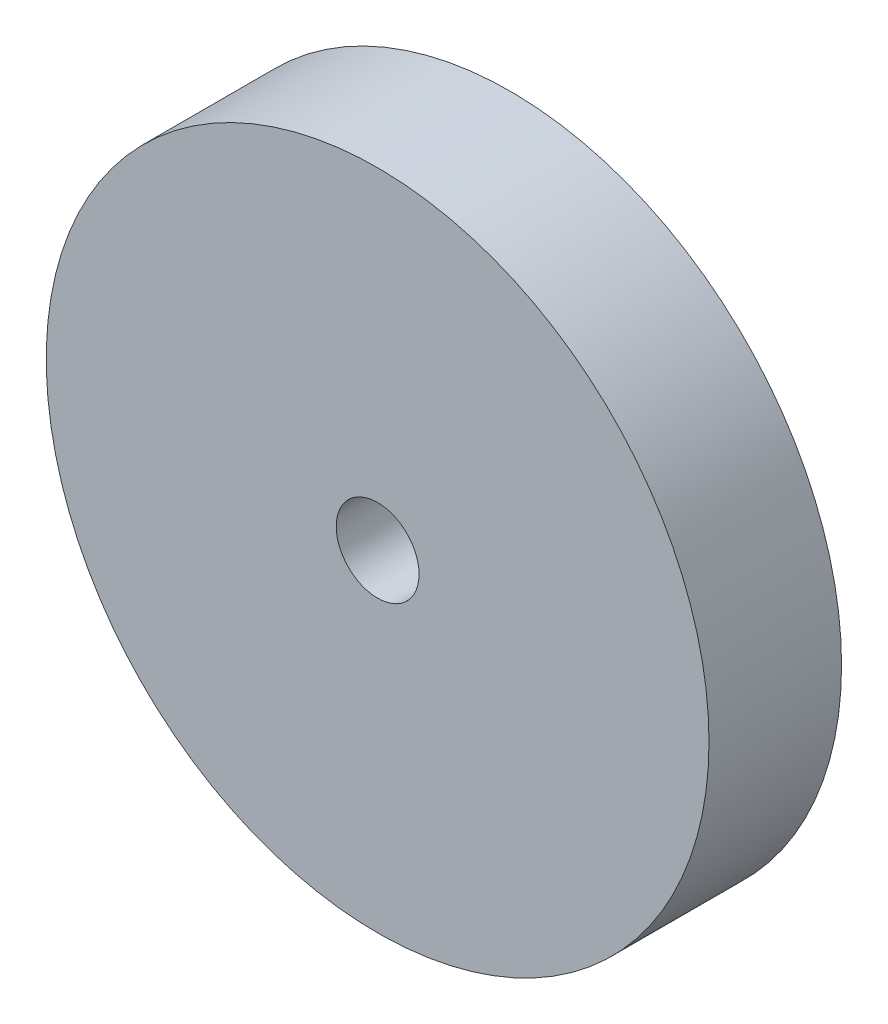
ISO-10303-21;
HEADER;
FILE_DESCRIPTION(('STEP AP214'),'2;1');
FILE_NAME('part.step','',(''),(''),'','','');
FILE_SCHEMA(('AUTOMOTIVE_DESIGN { 1 0 10303 214 1 1 1 1 }'));
ENDSEC;
DATA;
#1=APPLICATION_CONTEXT('core data for automotive mechanical design processes');
#2=APPLICATION_PROTOCOL_DEFINITION('international standard','automotive_design',2000,#1);
#3=PRODUCT_CONTEXT('',#1,'mechanical');
#4=PRODUCT('Part','Part','',(#3));
#5=PRODUCT_RELATED_PRODUCT_CATEGORY('part','',(#4));
#6=PRODUCT_DEFINITION_FORMATION('','',#4);
#7=PRODUCT_DEFINITION_CONTEXT('part definition',#1,'design');
#8=PRODUCT_DEFINITION('design','',#6,#7);
#9=PRODUCT_DEFINITION_SHAPE('','',#8);
#10=(LENGTH_UNIT() NAMED_UNIT(*) SI_UNIT(.MILLI.,.METRE.));
#11=(NAMED_UNIT(*) PLANE_ANGLE_UNIT() SI_UNIT($,.RADIAN.));
#12=(NAMED_UNIT(*) SI_UNIT($,.STERADIAN.) SOLID_ANGLE_UNIT());
#13=UNCERTAINTY_MEASURE_WITH_UNIT(LENGTH_MEASURE(1.E-05),#10,'distance_accuracy_value','');
#14=(GEOMETRIC_REPRESENTATION_CONTEXT(3) GLOBAL_UNCERTAINTY_ASSIGNED_CONTEXT((#13)) GLOBAL_UNIT_ASSIGNED_CONTEXT((#10,
#11,#12)) REPRESENTATION_CONTEXT('',''));
#15=CARTESIAN_POINT('',(0.,0.,0.));
#16=DIRECTION('',(0.,0.,1.));
#17=DIRECTION('',(1.,0.,0.));
#18=AXIS2_PLACEMENT_3D('',#15,#16,#17);
#19=CARTESIAN_POINT('',(-13.0879139075201,3.3421342287389,4.));
#20=DIRECTION('',(0.,0.,1.));
#21=DIRECTION('',(1.,0.,0.));
#22=AXIS2_PLACEMENT_3D('',#19,#20,#21);
#23=PLANE('',#22);
#24=CARTESIAN_POINT('',(-13.0879139075201,3.3421342287389,4.));
#25=DIRECTION('',(0.,0.,1.));
#26=DIRECTION('',(1.,0.,0.));
#27=AXIS2_PLACEMENT_3D('',#24,#25,#26);
#28=CIRCLE('',#27,10.);
#29=CARTESIAN_POINT('',(-3.08791390752013,3.3421342287389,4.));
#30=VERTEX_POINT('',#29);
#31=EDGE_CURVE('E10',#30,#30,#28,.T.);
#32=ORIENTED_EDGE('',*,*,#31,.T.);
#33=EDGE_LOOP('',(#32));
#34=FACE_BOUND('',#33,.T.);
#35=CARTESIAN_POINT('',(-13.0879139075201,3.3421342287389,4.));
#36=DIRECTION('',(0.,0.,1.));
#37=DIRECTION('',(1.,0.,0.));
#38=AXIS2_PLACEMENT_3D('',#35,#36,#37);
#39=CIRCLE('',#38,1.25);
#40=CARTESIAN_POINT('',(-11.8379139075201,3.3421342287389,4.));
#41=VERTEX_POINT('',#40);
#42=EDGE_CURVE('E41',#41,#41,#39,.T.);
#43=ORIENTED_EDGE('',*,*,#42,.F.);
#44=EDGE_LOOP('',(#43));
#45=FACE_BOUND('',#44,.T.);
#46=ADVANCED_FACE('F30',(#34,#45),#23,.T.);
#47=CARTESIAN_POINT('',(-13.0879139075201,3.3421342287389,0.));
#48=DIRECTION('',(0.,0.,1.));
#49=DIRECTION('',(1.,0.,0.));
#50=AXIS2_PLACEMENT_3D('',#47,#48,#49);
#51=PLANE('',#50);
#52=CARTESIAN_POINT('',(-13.0879139075201,3.3421342287389,0.));
#53=DIRECTION('',(0.,0.,1.));
#54=DIRECTION('',(1.,0.,0.));
#55=AXIS2_PLACEMENT_3D('',#52,#53,#54);
#56=CIRCLE('',#55,10.);
#57=CARTESIAN_POINT('',(-3.08791390752013,3.3421342287389,0.));
#58=VERTEX_POINT('',#57);
#59=EDGE_CURVE('E34',#58,#58,#56,.T.);
#60=ORIENTED_EDGE('',*,*,#59,.F.);
#61=EDGE_LOOP('',(#60));
#62=FACE_BOUND('',#61,.T.);
#63=CARTESIAN_POINT('',(-13.0879139075201,3.3421342287389,0.));
#64=DIRECTION('',(0.,0.,1.));
#65=DIRECTION('',(1.,0.,0.));
#66=AXIS2_PLACEMENT_3D('',#63,#64,#65);
#67=CIRCLE('',#66,1.25);
#68=CARTESIAN_POINT('',(-11.8379139075201,3.3421342287389,0.));
#69=VERTEX_POINT('',#68);
#70=EDGE_CURVE('E43',#69,#69,#67,.T.);
#71=ORIENTED_EDGE('',*,*,#70,.T.);
#72=EDGE_LOOP('',(#71));
#73=FACE_BOUND('',#72,.T.);
#74=ADVANCED_FACE('F53',(#62,#73),#51,.F.);
#75=CARTESIAN_POINT('',(-13.0879139075201,3.3421342287389,4.));
#76=DIRECTION('',(0.,0.,-1.));
#77=DIRECTION('',(-1.,0.,0.));
#78=AXIS2_PLACEMENT_3D('',#75,#76,#77);
#79=CYLINDRICAL_SURFACE('',#78,10.);
#80=ORIENTED_EDGE('',*,*,#31,.F.);
#81=EDGE_LOOP('',(#80));
#82=FACE_BOUND('',#81,.T.);
#83=ORIENTED_EDGE('',*,*,#59,.T.);
#84=EDGE_LOOP('',(#83));
#85=FACE_BOUND('',#84,.T.);
#86=ADVANCED_FACE('F32',(#82,#85),#79,.T.);
#87=CARTESIAN_POINT('',(-13.0879139075201,3.3421342287389,4.));
#88=DIRECTION('',(0.,0.,-1.));
#89=DIRECTION('',(-1.,0.,0.));
#90=AXIS2_PLACEMENT_3D('',#87,#88,#89);
#91=CYLINDRICAL_SURFACE('',#90,1.25);
#92=ORIENTED_EDGE('',*,*,#42,.T.);
#93=EDGE_LOOP('',(#92));
#94=FACE_BOUND('',#93,.T.);
#95=ORIENTED_EDGE('',*,*,#70,.F.);
#96=EDGE_LOOP('',(#95));
#97=FACE_BOUND('',#96,.T.);
#98=ADVANCED_FACE('F49',(#94,#97),#91,.F.);
#99=CLOSED_SHELL('',(#46,#74,#86,#98));
#100=MANIFOLD_SOLID_BREP('B2',#99);
#101=ADVANCED_BREP_SHAPE_REPRESENTATION('',(#18,#100),#14);
#102=SHAPE_DEFINITION_REPRESENTATION(#9,#101);
ENDSEC;
END-ISO-10303-21;
